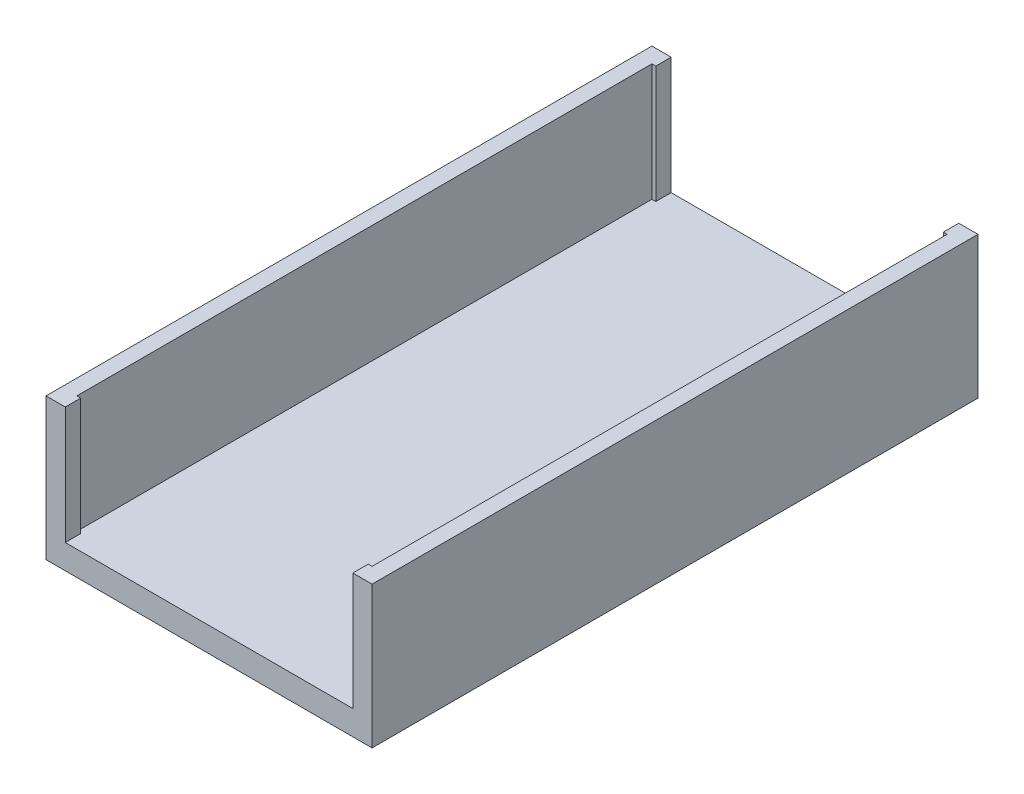
ISO-10303-21;
HEADER;
FILE_DESCRIPTION(('STEP AP214'),'2;1');
FILE_NAME('part.step','',(''),(''),'','','');
FILE_SCHEMA(('AUTOMOTIVE_DESIGN { 1 0 10303 214 1 1 1 1 }'));
ENDSEC;
DATA;
#1=APPLICATION_CONTEXT('core data for automotive mechanical design processes');
#2=APPLICATION_PROTOCOL_DEFINITION('international standard','automotive_design',2000,#1);
#3=PRODUCT_CONTEXT('',#1,'mechanical');
#4=PRODUCT('Part','Part','',(#3));
#5=PRODUCT_RELATED_PRODUCT_CATEGORY('part','',(#4));
#6=PRODUCT_DEFINITION_FORMATION('','',#4);
#7=PRODUCT_DEFINITION_CONTEXT('part definition',#1,'design');
#8=PRODUCT_DEFINITION('design','',#6,#7);
#9=PRODUCT_DEFINITION_SHAPE('','',#8);
#10=(LENGTH_UNIT() NAMED_UNIT(*) SI_UNIT(.MILLI.,.METRE.));
#11=(NAMED_UNIT(*) PLANE_ANGLE_UNIT() SI_UNIT($,.RADIAN.));
#12=(NAMED_UNIT(*) SI_UNIT($,.STERADIAN.) SOLID_ANGLE_UNIT());
#13=UNCERTAINTY_MEASURE_WITH_UNIT(LENGTH_MEASURE(1.E-05),#10,'distance_accuracy_value','');
#14=(GEOMETRIC_REPRESENTATION_CONTEXT(3) GLOBAL_UNCERTAINTY_ASSIGNED_CONTEXT((#13)) GLOBAL_UNIT_ASSIGNED_CONTEXT((#10,
#11,#12)) REPRESENTATION_CONTEXT('',''));
#15=CARTESIAN_POINT('',(0.,0.,0.));
#16=DIRECTION('',(0.,0.,1.));
#17=DIRECTION('',(1.,0.,0.));
#18=AXIS2_PLACEMENT_3D('',#15,#16,#17);
#19=CARTESIAN_POINT('',(0.,28.067,0.));
#20=DIRECTION('',(0.,-1.,0.));
#21=DIRECTION('',(0.,0.,-1.));
#22=AXIS2_PLACEMENT_3D('',#19,#20,#21);
#23=PLANE('',#22);
#24=DIRECTION('',(-1.,0.,0.));
#25=VECTOR('',#24,1.);
#26=CARTESIAN_POINT('',(61.468,28.067,-116.84));
#27=LINE('',#26,#25);
#28=CARTESIAN_POINT('',(3.80999999999999,28.067,-116.84));
#29=VERTEX_POINT('',#28);
#30=CARTESIAN_POINT('',(3.048,28.067,-116.84));
#31=VERTEX_POINT('',#30);
#32=EDGE_CURVE('E189',#29,#31,#27,.T.);
#33=ORIENTED_EDGE('',*,*,#32,.F.);
#34=DIRECTION('',(0.,0.,1.));
#35=VECTOR('',#34,1.);
#36=CARTESIAN_POINT('',(3.80999999999999,28.067,-116.84));
#37=LINE('',#36,#35);
#38=CARTESIAN_POINT('',(3.80999999999999,28.067,-119.888));
#39=VERTEX_POINT('',#38);
#40=EDGE_CURVE('E251',#39,#29,#37,.T.);
#41=ORIENTED_EDGE('',*,*,#40,.F.);
#42=DIRECTION('',(-1.,0.,0.));
#43=VECTOR('',#42,1.);
#44=CARTESIAN_POINT('',(0.,28.067,-119.888));
#45=LINE('',#44,#43);
#46=CARTESIAN_POINT('',(0.,28.067,-119.888));
#47=VERTEX_POINT('',#46);
#48=EDGE_CURVE('E210',#39,#47,#45,.T.);
#49=ORIENTED_EDGE('',*,*,#48,.T.);
#50=DIRECTION('',(0.,0.,1.));
#51=VECTOR('',#50,1.);
#52=CARTESIAN_POINT('',(0.,28.067,0.));
#53=LINE('',#52,#51);
#54=CARTESIAN_POINT('',(0.,28.067,0.));
#55=VERTEX_POINT('',#54);
#56=EDGE_CURVE('E200',#47,#55,#53,.T.);
#57=ORIENTED_EDGE('',*,*,#56,.T.);
#58=DIRECTION('',(1.,0.,0.));
#59=VECTOR('',#58,1.);
#60=CARTESIAN_POINT('',(0.,28.067,0.));
#61=LINE('',#60,#59);
#62=CARTESIAN_POINT('',(3.81,28.067,0.));
#63=VERTEX_POINT('',#62);
#64=EDGE_CURVE('E205',#55,#63,#61,.T.);
#65=ORIENTED_EDGE('',*,*,#64,.T.);
#66=DIRECTION('',(0.,0.,1.));
#67=VECTOR('',#66,1.);
#68=CARTESIAN_POINT('',(3.81,28.067,-3.048));
#69=LINE('',#68,#67);
#70=CARTESIAN_POINT('',(3.81,28.067,-3.048));
#71=VERTEX_POINT('',#70);
#72=EDGE_CURVE('E270',#71,#63,#69,.T.);
#73=ORIENTED_EDGE('',*,*,#72,.F.);
#74=DIRECTION('',(1.,0.,0.));
#75=VECTOR('',#74,1.);
#76=CARTESIAN_POINT('',(3.048,28.067,-3.048));
#77=LINE('',#76,#75);
#78=CARTESIAN_POINT('',(3.048,28.067,-3.048));
#79=VERTEX_POINT('',#78);
#80=EDGE_CURVE('E183',#79,#71,#77,.T.);
#81=ORIENTED_EDGE('',*,*,#80,.F.);
#82=DIRECTION('',(0.,0.,1.));
#83=VECTOR('',#82,1.);
#84=CARTESIAN_POINT('',(3.048,28.067,-116.84));
#85=LINE('',#84,#83);
#86=EDGE_CURVE('E179',#31,#79,#85,.T.);
#87=ORIENTED_EDGE('',*,*,#86,.F.);
#88=EDGE_LOOP('',(#33,#41,#49,#57,#65,#73,#81,#87));
#89=FACE_BOUND('',#88,.T.);
#90=ADVANCED_FACE('F34',(#89),#23,.F.);
#91=CARTESIAN_POINT('',(61.468,4.8514,-116.84));
#92=DIRECTION('',(0.,0.,-1.));
#93=DIRECTION('',(-1.,0.,0.));
#94=AXIS2_PLACEMENT_3D('',#91,#92,#93);
#95=PLANE('',#94);
#96=DIRECTION('',(-1.,0.,0.));
#97=VECTOR('',#96,1.);
#98=CARTESIAN_POINT('',(61.468,4.8514,-116.84));
#99=LINE('',#98,#97);
#100=CARTESIAN_POINT('',(3.80999999999999,4.8514,-116.84));
#101=VERTEX_POINT('',#100);
#102=CARTESIAN_POINT('',(3.048,4.8514,-116.84));
#103=VERTEX_POINT('',#102);
#104=EDGE_CURVE('E171',#101,#103,#99,.T.);
#105=ORIENTED_EDGE('',*,*,#104,.F.);
#106=DIRECTION('',(0.,1.,0.));
#107=VECTOR('',#106,1.);
#108=CARTESIAN_POINT('',(3.80999999999999,4.8514,-116.84));
#109=LINE('',#108,#107);
#110=EDGE_CURVE('E163',#101,#29,#109,.T.);
#111=ORIENTED_EDGE('',*,*,#110,.T.);
#112=ORIENTED_EDGE('',*,*,#32,.T.);
#113=DIRECTION('',(0.,1.,0.));
#114=VECTOR('',#113,1.);
#115=CARTESIAN_POINT('',(3.048,4.8514,-116.84));
#116=LINE('',#115,#114);
#117=EDGE_CURVE('E192',#103,#31,#116,.T.);
#118=ORIENTED_EDGE('',*,*,#117,.F.);
#119=EDGE_LOOP('',(#105,#111,#112,#118));
#120=FACE_BOUND('',#119,.T.);
#121=ADVANCED_FACE('F301',(#120),#95,.F.);
#122=CARTESIAN_POINT('',(3.048,4.8514,-3.048));
#123=DIRECTION('',(0.,0.,1.));
#124=DIRECTION('',(1.,0.,0.));
#125=AXIS2_PLACEMENT_3D('',#122,#123,#124);
#126=PLANE('',#125);
#127=ORIENTED_EDGE('',*,*,#80,.T.);
#128=DIRECTION('',(0.,1.,0.));
#129=VECTOR('',#128,1.);
#130=CARTESIAN_POINT('',(3.81,4.8514,-3.048));
#131=LINE('',#130,#129);
#132=CARTESIAN_POINT('',(3.81,4.8514,-3.048));
#133=VERTEX_POINT('',#132);
#134=EDGE_CURVE('E273',#133,#71,#131,.T.);
#135=ORIENTED_EDGE('',*,*,#134,.F.);
#136=DIRECTION('',(1.,0.,0.));
#137=VECTOR('',#136,1.);
#138=CARTESIAN_POINT('',(3.048,4.8514,-3.048));
#139=LINE('',#138,#137);
#140=CARTESIAN_POINT('',(3.048,4.8514,-3.048));
#141=VERTEX_POINT('',#140);
#142=EDGE_CURVE('E283',#141,#133,#139,.T.);
#143=ORIENTED_EDGE('',*,*,#142,.F.);
#144=DIRECTION('',(0.,1.,0.));
#145=VECTOR('',#144,1.);
#146=CARTESIAN_POINT('',(3.048,4.8514,-3.048));
#147=LINE('',#146,#145);
#148=EDGE_CURVE('E170',#141,#79,#147,.T.);
#149=ORIENTED_EDGE('',*,*,#148,.T.);
#150=EDGE_LOOP('',(#127,#135,#143,#149));
#151=FACE_BOUND('',#150,.T.);
#152=ADVANCED_FACE('F309',(#151),#126,.F.);
#153=CARTESIAN_POINT('',(0.,28.067,0.));
#154=DIRECTION('',(1.,0.,0.));
#155=DIRECTION('',(0.,0.,-1.));
#156=AXIS2_PLACEMENT_3D('',#153,#154,#155);
#157=PLANE('',#156);
#158=DIRECTION('',(0.,0.,1.));
#159=VECTOR('',#158,1.);
#160=CARTESIAN_POINT('',(0.,0.,0.));
#161=LINE('',#160,#159);
#162=CARTESIAN_POINT('',(0.,0.,-119.888));
#163=VERTEX_POINT('',#162);
#164=CARTESIAN_POINT('',(0.,0.,0.));
#165=VERTEX_POINT('',#164);
#166=EDGE_CURVE('E195',#163,#165,#161,.T.);
#167=ORIENTED_EDGE('',*,*,#166,.T.);
#168=DIRECTION('',(0.,-1.,0.));
#169=VECTOR('',#168,1.);
#170=CARTESIAN_POINT('',(0.,28.067,0.));
#171=LINE('',#170,#169);
#172=EDGE_CURVE('E11',#55,#165,#171,.T.);
#173=ORIENTED_EDGE('',*,*,#172,.F.);
#174=ORIENTED_EDGE('',*,*,#56,.F.);
#175=DIRECTION('',(0.,-1.,0.));
#176=VECTOR('',#175,1.);
#177=CARTESIAN_POINT('',(0.,28.067,-119.888));
#178=LINE('',#177,#176);
#179=EDGE_CURVE('E214',#47,#163,#178,.T.);
#180=ORIENTED_EDGE('',*,*,#179,.T.);
#181=EDGE_LOOP('',(#167,#173,#174,#180));
#182=FACE_BOUND('',#181,.T.);
#183=ADVANCED_FACE('F36',(#182),#157,.F.);
#184=CARTESIAN_POINT('',(0.,28.067,0.));
#185=DIRECTION('',(0.,0.,-1.));
#186=DIRECTION('',(-1.,0.,0.));
#187=AXIS2_PLACEMENT_3D('',#184,#185,#186);
#188=PLANE('',#187);
#189=DIRECTION('',(1.,0.,0.));
#190=VECTOR('',#189,1.);
#191=CARTESIAN_POINT('',(3.81,4.8514,0.));
#192=LINE('',#191,#190);
#193=CARTESIAN_POINT('',(3.81,4.8514,0.));
#194=VERTEX_POINT('',#193);
#195=CARTESIAN_POINT('',(60.706,4.8514,0.));
#196=VERTEX_POINT('',#195);
#197=EDGE_CURVE('E265',#194,#196,#192,.T.);
#198=ORIENTED_EDGE('',*,*,#197,.F.);
#199=DIRECTION('',(0.,1.,0.));
#200=VECTOR('',#199,1.);
#201=CARTESIAN_POINT('',(3.81,4.8514,0.));
#202=LINE('',#201,#200);
#203=EDGE_CURVE('E269',#194,#63,#202,.T.);
#204=ORIENTED_EDGE('',*,*,#203,.T.);
#205=ORIENTED_EDGE('',*,*,#64,.F.);
#206=ORIENTED_EDGE('',*,*,#172,.T.);
#207=DIRECTION('',(1.,0.,0.));
#208=VECTOR('',#207,1.);
#209=CARTESIAN_POINT('',(0.,0.,0.));
#210=LINE('',#209,#208);
#211=CARTESIAN_POINT('',(64.516,0.,0.));
#212=VERTEX_POINT('',#211);
#213=EDGE_CURVE('E217',#165,#212,#210,.T.);
#214=ORIENTED_EDGE('',*,*,#213,.T.);
#215=DIRECTION('',(0.,-1.,0.));
#216=VECTOR('',#215,1.);
#217=CARTESIAN_POINT('',(64.516,28.067,0.));
#218=LINE('',#217,#216);
#219=CARTESIAN_POINT('',(64.516,28.067,0.));
#220=VERTEX_POINT('',#219);
#221=EDGE_CURVE('E42',#220,#212,#218,.T.);
#222=ORIENTED_EDGE('',*,*,#221,.F.);
#223=CARTESIAN_POINT('',(60.706,28.067,0.));
#224=VERTEX_POINT('',#223);
#225=EDGE_CURVE('E203',#224,#220,#61,.T.);
#226=ORIENTED_EDGE('',*,*,#225,.F.);
#227=DIRECTION('',(0.,1.,0.));
#228=VECTOR('',#227,1.);
#229=CARTESIAN_POINT('',(60.706,4.8514,0.));
#230=LINE('',#229,#228);
#231=EDGE_CURVE('E278',#196,#224,#230,.T.);
#232=ORIENTED_EDGE('',*,*,#231,.F.);
#233=EDGE_LOOP('',(#198,#204,#205,#206,#214,#222,#226,#232));
#234=FACE_BOUND('',#233,.T.);
#235=ADVANCED_FACE('F315',(#234),#188,.F.);
#236=CARTESIAN_POINT('',(64.516,28.067,0.));
#237=DIRECTION('',(-1.,0.,0.));
#238=DIRECTION('',(0.,0.,1.));
#239=AXIS2_PLACEMENT_3D('',#236,#237,#238);
#240=PLANE('',#239);
#241=DIRECTION('',(0.,0.,-1.));
#242=VECTOR('',#241,1.);
#243=CARTESIAN_POINT('',(64.516,0.,0.));
#244=LINE('',#243,#242);
#245=CARTESIAN_POINT('',(64.516,0.,-119.888));
#246=VERTEX_POINT('',#245);
#247=EDGE_CURVE('E219',#212,#246,#244,.T.);
#248=ORIENTED_EDGE('',*,*,#247,.T.);
#249=DIRECTION('',(0.,-1.,0.));
#250=VECTOR('',#249,1.);
#251=CARTESIAN_POINT('',(64.516,28.067,-119.888));
#252=LINE('',#251,#250);
#253=CARTESIAN_POINT('',(64.516,28.067,-119.888));
#254=VERTEX_POINT('',#253);
#255=EDGE_CURVE('E224',#254,#246,#252,.T.);
#256=ORIENTED_EDGE('',*,*,#255,.F.);
#257=DIRECTION('',(0.,0.,-1.));
#258=VECTOR('',#257,1.);
#259=CARTESIAN_POINT('',(64.516,28.067,0.));
#260=LINE('',#259,#258);
#261=EDGE_CURVE('E208',#220,#254,#260,.T.);
#262=ORIENTED_EDGE('',*,*,#261,.F.);
#263=ORIENTED_EDGE('',*,*,#221,.T.);
#264=EDGE_LOOP('',(#248,#256,#262,#263));
#265=FACE_BOUND('',#264,.T.);
#266=ADVANCED_FACE('F231',(#265),#240,.F.);
#267=CARTESIAN_POINT('',(0.,28.067,-119.888));
#268=DIRECTION('',(0.,0.,1.));
#269=DIRECTION('',(1.,0.,0.));
#270=AXIS2_PLACEMENT_3D('',#267,#268,#269);
#271=PLANE('',#270);
#272=ORIENTED_EDGE('',*,*,#48,.F.);
#273=DIRECTION('',(0.,1.,0.));
#274=VECTOR('',#273,1.);
#275=CARTESIAN_POINT('',(3.80999999999999,4.8514,-119.888));
#276=LINE('',#275,#274);
#277=CARTESIAN_POINT('',(3.80999999999999,4.8514,-119.888));
#278=VERTEX_POINT('',#277);
#279=EDGE_CURVE('E182',#278,#39,#276,.T.);
#280=ORIENTED_EDGE('',*,*,#279,.F.);
#281=DIRECTION('',(-1.,0.,0.));
#282=VECTOR('',#281,1.);
#283=CARTESIAN_POINT('',(3.80999999999999,4.8514,-119.888));
#284=LINE('',#283,#282);
#285=CARTESIAN_POINT('',(60.706,4.8514,-119.888));
#286=VERTEX_POINT('',#285);
#287=EDGE_CURVE('E154',#286,#278,#284,.T.);
#288=ORIENTED_EDGE('',*,*,#287,.F.);
#289=DIRECTION('',(0.,1.,0.));
#290=VECTOR('',#289,1.);
#291=CARTESIAN_POINT('',(60.706,4.8514,-119.888));
#292=LINE('',#291,#290);
#293=CARTESIAN_POINT('',(60.706,28.067,-119.888));
#294=VERTEX_POINT('',#293);
#295=EDGE_CURVE('E151',#286,#294,#292,.T.);
#296=ORIENTED_EDGE('',*,*,#295,.T.);
#297=EDGE_CURVE('E211',#254,#294,#45,.T.);
#298=ORIENTED_EDGE('',*,*,#297,.F.);
#299=ORIENTED_EDGE('',*,*,#255,.T.);
#300=DIRECTION('',(-1.,0.,0.));
#301=VECTOR('',#300,1.);
#302=CARTESIAN_POINT('',(0.,0.,-119.888));
#303=LINE('',#302,#301);
#304=EDGE_CURVE('E204',#246,#163,#303,.T.);
#305=ORIENTED_EDGE('',*,*,#304,.T.);
#306=ORIENTED_EDGE('',*,*,#179,.F.);
#307=EDGE_LOOP('',(#272,#280,#288,#296,#298,#299,#305,#306));
#308=FACE_BOUND('',#307,.T.);
#309=ADVANCED_FACE('F242',(#308),#271,.F.);
#310=ORIENTED_EDGE('',*,*,#297,.T.);
#311=DIRECTION('',(0.,0.,-1.));
#312=VECTOR('',#311,1.);
#313=CARTESIAN_POINT('',(60.706,28.067,-116.84));
#314=LINE('',#313,#312);
#315=CARTESIAN_POINT('',(60.706,28.067,-116.84));
#316=VERTEX_POINT('',#315);
#317=EDGE_CURVE('E257',#316,#294,#314,.T.);
#318=ORIENTED_EDGE('',*,*,#317,.F.);
#319=CARTESIAN_POINT('',(61.468,28.067,-116.84));
#320=VERTEX_POINT('',#319);
#321=EDGE_CURVE('E162',#320,#316,#27,.T.);
#322=ORIENTED_EDGE('',*,*,#321,.F.);
#323=DIRECTION('',(0.,0.,-1.));
#324=VECTOR('',#323,1.);
#325=CARTESIAN_POINT('',(61.468,28.067,-3.048));
#326=LINE('',#325,#324);
#327=CARTESIAN_POINT('',(61.468,28.067,-3.048));
#328=VERTEX_POINT('',#327);
#329=EDGE_CURVE('E186',#328,#320,#326,.T.);
#330=ORIENTED_EDGE('',*,*,#329,.F.);
#331=CARTESIAN_POINT('',(60.706,28.067,-3.048));
#332=VERTEX_POINT('',#331);
#333=EDGE_CURVE('E181',#332,#328,#77,.T.);
#334=ORIENTED_EDGE('',*,*,#333,.F.);
#335=DIRECTION('',(0.,0.,-1.));
#336=VECTOR('',#335,1.);
#337=CARTESIAN_POINT('',(60.706,28.067,-3.048));
#338=LINE('',#337,#336);
#339=EDGE_CURVE('E266',#224,#332,#338,.T.);
#340=ORIENTED_EDGE('',*,*,#339,.F.);
#341=ORIENTED_EDGE('',*,*,#225,.T.);
#342=ORIENTED_EDGE('',*,*,#261,.T.);
#343=EDGE_LOOP('',(#310,#318,#322,#330,#334,#340,#341,#342));
#344=FACE_BOUND('',#343,.T.);
#345=ADVANCED_FACE('F295',(#344),#23,.F.);
#346=CARTESIAN_POINT('',(0.,0.,0.));
#347=DIRECTION('',(0.,-1.,0.));
#348=DIRECTION('',(0.,0.,-1.));
#349=AXIS2_PLACEMENT_3D('',#346,#347,#348);
#350=PLANE('',#349);
#351=ORIENTED_EDGE('',*,*,#166,.F.);
#352=ORIENTED_EDGE('',*,*,#304,.F.);
#353=ORIENTED_EDGE('',*,*,#247,.F.);
#354=ORIENTED_EDGE('',*,*,#213,.F.);
#355=EDGE_LOOP('',(#351,#352,#353,#354));
#356=FACE_BOUND('',#355,.T.);
#357=ADVANCED_FACE('F238',(#356),#350,.T.);
#358=CARTESIAN_POINT('',(3.048,4.8514,-116.84));
#359=DIRECTION('',(-1.,0.,0.));
#360=DIRECTION('',(0.,0.,1.));
#361=AXIS2_PLACEMENT_3D('',#358,#359,#360);
#362=PLANE('',#361);
#363=ORIENTED_EDGE('',*,*,#86,.T.);
#364=ORIENTED_EDGE('',*,*,#148,.F.);
#365=DIRECTION('',(0.,0.,1.));
#366=VECTOR('',#365,1.);
#367=CARTESIAN_POINT('',(3.048,4.8514,-116.84));
#368=LINE('',#367,#366);
#369=EDGE_CURVE('E191',#103,#141,#368,.T.);
#370=ORIENTED_EDGE('',*,*,#369,.F.);
#371=ORIENTED_EDGE('',*,*,#117,.T.);
#372=EDGE_LOOP('',(#363,#364,#370,#371));
#373=FACE_BOUND('',#372,.T.);
#374=ADVANCED_FACE('F306',(#373),#362,.F.);
#375=ORIENTED_EDGE('',*,*,#321,.T.);
#376=DIRECTION('',(0.,1.,0.));
#377=VECTOR('',#376,1.);
#378=CARTESIAN_POINT('',(60.706,4.8514,-116.84));
#379=LINE('',#378,#377);
#380=CARTESIAN_POINT('',(60.706,4.8514,-116.84));
#381=VERTEX_POINT('',#380);
#382=EDGE_CURVE('E148',#381,#316,#379,.T.);
#383=ORIENTED_EDGE('',*,*,#382,.F.);
#384=CARTESIAN_POINT('',(61.468,4.8514,-116.84));
#385=VERTEX_POINT('',#384);
#386=EDGE_CURVE('E160',#385,#381,#99,.T.);
#387=ORIENTED_EDGE('',*,*,#386,.F.);
#388=DIRECTION('',(0.,1.,0.));
#389=VECTOR('',#388,1.);
#390=CARTESIAN_POINT('',(61.468,4.8514,-116.84));
#391=LINE('',#390,#389);
#392=EDGE_CURVE('E196',#385,#320,#391,.T.);
#393=ORIENTED_EDGE('',*,*,#392,.T.);
#394=EDGE_LOOP('',(#375,#383,#387,#393));
#395=FACE_BOUND('',#394,.T.);
#396=ADVANCED_FACE('F159',(#395),#95,.F.);
#397=CARTESIAN_POINT('',(61.468,4.8514,-3.048));
#398=DIRECTION('',(1.,0.,0.));
#399=DIRECTION('',(0.,0.,-1.));
#400=AXIS2_PLACEMENT_3D('',#397,#398,#399);
#401=PLANE('',#400);
#402=ORIENTED_EDGE('',*,*,#329,.T.);
#403=ORIENTED_EDGE('',*,*,#392,.F.);
#404=DIRECTION('',(0.,0.,-1.));
#405=VECTOR('',#404,1.);
#406=CARTESIAN_POINT('',(61.468,4.8514,-3.048));
#407=LINE('',#406,#405);
#408=CARTESIAN_POINT('',(61.468,4.8514,-3.048));
#409=VERTEX_POINT('',#408);
#410=EDGE_CURVE('E169',#409,#385,#407,.T.);
#411=ORIENTED_EDGE('',*,*,#410,.F.);
#412=DIRECTION('',(0.,1.,0.));
#413=VECTOR('',#412,1.);
#414=CARTESIAN_POINT('',(61.468,4.8514,-3.048));
#415=LINE('',#414,#413);
#416=EDGE_CURVE('E174',#409,#328,#415,.T.);
#417=ORIENTED_EDGE('',*,*,#416,.T.);
#418=EDGE_LOOP('',(#402,#403,#411,#417));
#419=FACE_BOUND('',#418,.T.);
#420=ADVANCED_FACE('F293',(#419),#401,.F.);
#421=CARTESIAN_POINT('',(60.706,4.8514,-3.048));
#422=VERTEX_POINT('',#421);
#423=EDGE_CURVE('E282',#422,#409,#139,.T.);
#424=ORIENTED_EDGE('',*,*,#423,.F.);
#425=DIRECTION('',(0.,1.,0.));
#426=VECTOR('',#425,1.);
#427=CARTESIAN_POINT('',(60.706,4.8514,-3.048));
#428=LINE('',#427,#426);
#429=EDGE_CURVE('E275',#422,#332,#428,.T.);
#430=ORIENTED_EDGE('',*,*,#429,.T.);
#431=ORIENTED_EDGE('',*,*,#333,.T.);
#432=ORIENTED_EDGE('',*,*,#416,.F.);
#433=EDGE_LOOP('',(#424,#430,#431,#432));
#434=FACE_BOUND('',#433,.T.);
#435=ADVANCED_FACE('F289',(#434),#126,.F.);
#436=CARTESIAN_POINT('',(0.,4.8514,0.));
#437=DIRECTION('',(0.,1.,0.));
#438=DIRECTION('',(0.,0.,1.));
#439=AXIS2_PLACEMENT_3D('',#436,#437,#438);
#440=PLANE('',#439);
#441=ORIENTED_EDGE('',*,*,#369,.T.);
#442=ORIENTED_EDGE('',*,*,#142,.T.);
#443=DIRECTION('',(0.,0.,1.));
#444=VECTOR('',#443,1.);
#445=CARTESIAN_POINT('',(3.81,4.8514,-3.048));
#446=LINE('',#445,#444);
#447=EDGE_CURVE('E262',#133,#194,#446,.T.);
#448=ORIENTED_EDGE('',*,*,#447,.T.);
#449=ORIENTED_EDGE('',*,*,#197,.T.);
#450=DIRECTION('',(0.,0.,-1.));
#451=VECTOR('',#450,1.);
#452=CARTESIAN_POINT('',(60.706,4.8514,-3.048));
#453=LINE('',#452,#451);
#454=EDGE_CURVE('E56',#196,#422,#453,.T.);
#455=ORIENTED_EDGE('',*,*,#454,.T.);
#456=ORIENTED_EDGE('',*,*,#423,.T.);
#457=ORIENTED_EDGE('',*,*,#410,.T.);
#458=ORIENTED_EDGE('',*,*,#386,.T.);
#459=DIRECTION('',(0.,0.,-1.));
#460=VECTOR('',#459,1.);
#461=CARTESIAN_POINT('',(60.706,4.8514,-116.84));
#462=LINE('',#461,#460);
#463=EDGE_CURVE('E145',#381,#286,#462,.T.);
#464=ORIENTED_EDGE('',*,*,#463,.T.);
#465=ORIENTED_EDGE('',*,*,#287,.T.);
#466=DIRECTION('',(0.,0.,1.));
#467=VECTOR('',#466,1.);
#468=CARTESIAN_POINT('',(3.80999999999999,4.8514,-116.84));
#469=LINE('',#468,#467);
#470=EDGE_CURVE('E49',#278,#101,#469,.T.);
#471=ORIENTED_EDGE('',*,*,#470,.T.);
#472=ORIENTED_EDGE('',*,*,#104,.T.);
#473=EDGE_LOOP('',(#441,#442,#448,#449,#455,#456,#457,#458,#464,#465,#471,#472));
#474=FACE_BOUND('',#473,.T.);
#475=ADVANCED_FACE('F167',(#474),#440,.T.);
#476=CARTESIAN_POINT('',(3.81,4.8514,-3.048));
#477=DIRECTION('',(-1.,0.,0.));
#478=DIRECTION('',(0.,0.,1.));
#479=AXIS2_PLACEMENT_3D('',#476,#477,#478);
#480=PLANE('',#479);
#481=ORIENTED_EDGE('',*,*,#72,.T.);
#482=ORIENTED_EDGE('',*,*,#203,.F.);
#483=ORIENTED_EDGE('',*,*,#447,.F.);
#484=ORIENTED_EDGE('',*,*,#134,.T.);
#485=EDGE_LOOP('',(#481,#482,#483,#484));
#486=FACE_BOUND('',#485,.T.);
#487=ADVANCED_FACE('F312',(#486),#480,.F.);
#488=CARTESIAN_POINT('',(60.706,4.8514,-3.048));
#489=DIRECTION('',(1.,0.,0.));
#490=DIRECTION('',(0.,0.,-1.));
#491=AXIS2_PLACEMENT_3D('',#488,#489,#490);
#492=PLANE('',#491);
#493=ORIENTED_EDGE('',*,*,#339,.T.);
#494=ORIENTED_EDGE('',*,*,#429,.F.);
#495=ORIENTED_EDGE('',*,*,#454,.F.);
#496=ORIENTED_EDGE('',*,*,#231,.T.);
#497=EDGE_LOOP('',(#493,#494,#495,#496));
#498=FACE_BOUND('',#497,.T.);
#499=ADVANCED_FACE('F318',(#498),#492,.F.);
#500=CARTESIAN_POINT('',(3.80999999999999,4.8514,-116.84));
#501=DIRECTION('',(-1.,0.,0.));
#502=DIRECTION('',(0.,0.,1.));
#503=AXIS2_PLACEMENT_3D('',#500,#501,#502);
#504=PLANE('',#503);
#505=ORIENTED_EDGE('',*,*,#40,.T.);
#506=ORIENTED_EDGE('',*,*,#110,.F.);
#507=ORIENTED_EDGE('',*,*,#470,.F.);
#508=ORIENTED_EDGE('',*,*,#279,.T.);
#509=EDGE_LOOP('',(#505,#506,#507,#508));
#510=FACE_BOUND('',#509,.T.);
#511=ADVANCED_FACE('F298',(#510),#504,.F.);
#512=CARTESIAN_POINT('',(60.706,4.8514,-116.84));
#513=DIRECTION('',(1.,0.,0.));
#514=DIRECTION('',(0.,0.,-1.));
#515=AXIS2_PLACEMENT_3D('',#512,#513,#514);
#516=PLANE('',#515);
#517=ORIENTED_EDGE('',*,*,#317,.T.);
#518=ORIENTED_EDGE('',*,*,#295,.F.);
#519=ORIENTED_EDGE('',*,*,#463,.F.);
#520=ORIENTED_EDGE('',*,*,#382,.T.);
#521=EDGE_LOOP('',(#517,#518,#519,#520));
#522=FACE_BOUND('',#521,.T.);
#523=ADVANCED_FACE('F147',(#522),#516,.F.);
#524=CLOSED_SHELL('',(#90,#121,#152,#183,#235,#266,#309,#345,#357,#374,#396,#420,#435,#475,#487,
#499,#511,#523));
#525=MANIFOLD_SOLID_BREP('B2',#524);
#526=ADVANCED_BREP_SHAPE_REPRESENTATION('',(#18,#525),#14);
#527=SHAPE_DEFINITION_REPRESENTATION(#9,#526);
ENDSEC;
END-ISO-10303-21;
